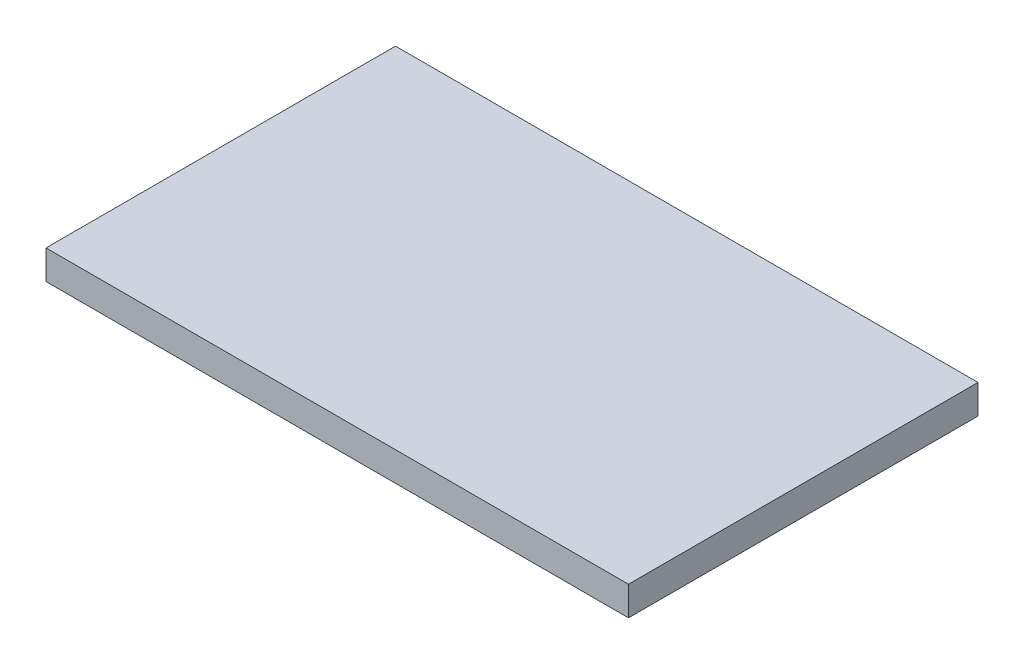
ISO-10303-21;
HEADER;
FILE_DESCRIPTION(('STEP AP214'),'2;1');
FILE_NAME('part.step','',(''),(''),'','','');
FILE_SCHEMA(('AUTOMOTIVE_DESIGN { 1 0 10303 214 1 1 1 1 }'));
ENDSEC;
DATA;
#1=APPLICATION_CONTEXT('core data for automotive mechanical design processes');
#2=APPLICATION_PROTOCOL_DEFINITION('international standard','automotive_design',2000,#1);
#3=PRODUCT_CONTEXT('',#1,'mechanical');
#4=PRODUCT('Part','Part','',(#3));
#5=PRODUCT_RELATED_PRODUCT_CATEGORY('part','',(#4));
#6=PRODUCT_DEFINITION_FORMATION('','',#4);
#7=PRODUCT_DEFINITION_CONTEXT('part definition',#1,'design');
#8=PRODUCT_DEFINITION('design','',#6,#7);
#9=PRODUCT_DEFINITION_SHAPE('','',#8);
#10=(LENGTH_UNIT() NAMED_UNIT(*) SI_UNIT(.MILLI.,.METRE.));
#11=(NAMED_UNIT(*) PLANE_ANGLE_UNIT() SI_UNIT($,.RADIAN.));
#12=(NAMED_UNIT(*) SI_UNIT($,.STERADIAN.) SOLID_ANGLE_UNIT());
#13=UNCERTAINTY_MEASURE_WITH_UNIT(LENGTH_MEASURE(1.E-05),#10,'distance_accuracy_value','');
#14=(GEOMETRIC_REPRESENTATION_CONTEXT(3) GLOBAL_UNCERTAINTY_ASSIGNED_CONTEXT((#13)) GLOBAL_UNIT_ASSIGNED_CONTEXT((#10,
#11,#12)) REPRESENTATION_CONTEXT('',''));
#15=CARTESIAN_POINT('',(0.,0.,0.));
#16=DIRECTION('',(0.,0.,1.));
#17=DIRECTION('',(1.,0.,0.));
#18=AXIS2_PLACEMENT_3D('',#15,#16,#17);
#19=CARTESIAN_POINT('',(88.9,38.1,76.2));
#20=DIRECTION('',(-1.,0.,0.));
#21=DIRECTION('',(0.,0.,1.));
#22=AXIS2_PLACEMENT_3D('',#19,#20,#21);
#23=PLANE('',#22);
#24=DIRECTION('',(0.,1.,0.));
#25=VECTOR('',#24,1.);
#26=CARTESIAN_POINT('',(88.9,38.1,0.));
#27=LINE('',#26,#25);
#28=CARTESIAN_POINT('',(88.9,31.75,0.));
#29=VERTEX_POINT('',#28);
#30=CARTESIAN_POINT('',(88.9,38.1,0.));
#31=VERTEX_POINT('',#30);
#32=EDGE_CURVE('E96',#29,#31,#27,.T.);
#33=ORIENTED_EDGE('',*,*,#32,.T.);
#34=DIRECTION('',(0.,0.,-1.));
#35=VECTOR('',#34,1.);
#36=CARTESIAN_POINT('',(88.9,38.1,76.2));
#37=LINE('',#36,#35);
#38=CARTESIAN_POINT('',(88.9,38.1,76.2));
#39=VERTEX_POINT('',#38);
#40=EDGE_CURVE('E11',#39,#31,#37,.T.);
#41=ORIENTED_EDGE('',*,*,#40,.F.);
#42=DIRECTION('',(0.,1.,0.));
#43=VECTOR('',#42,1.);
#44=CARTESIAN_POINT('',(88.9,38.1,76.2));
#45=LINE('',#44,#43);
#46=CARTESIAN_POINT('',(88.9,31.75,76.2));
#47=VERTEX_POINT('',#46);
#48=EDGE_CURVE('E84',#47,#39,#45,.T.);
#49=ORIENTED_EDGE('',*,*,#48,.F.);
#50=DIRECTION('',(0.,0.,-1.));
#51=VECTOR('',#50,1.);
#52=CARTESIAN_POINT('',(88.9,31.75,76.2));
#53=LINE('',#52,#51);
#54=EDGE_CURVE('E92',#47,#29,#53,.T.);
#55=ORIENTED_EDGE('',*,*,#54,.T.);
#56=EDGE_LOOP('',(#33,#41,#49,#55));
#57=FACE_BOUND('',#56,.T.);
#58=ADVANCED_FACE('F33',(#57),#23,.F.);
#59=CARTESIAN_POINT('',(88.9,38.1,76.2));
#60=DIRECTION('',(0.,-1.,0.));
#61=DIRECTION('',(1.,0.,0.));
#62=AXIS2_PLACEMENT_3D('',#59,#60,#61);
#63=PLANE('',#62);
#64=DIRECTION('',(-1.,0.,0.));
#65=VECTOR('',#64,1.);
#66=CARTESIAN_POINT('',(88.9,38.1,0.));
#67=LINE('',#66,#65);
#68=CARTESIAN_POINT('',(-38.1,38.1,0.));
#69=VERTEX_POINT('',#68);
#70=EDGE_CURVE('E88',#31,#69,#67,.T.);
#71=ORIENTED_EDGE('',*,*,#70,.T.);
#72=DIRECTION('',(0.,0.,-1.));
#73=VECTOR('',#72,1.);
#74=CARTESIAN_POINT('',(-38.1,38.1,76.2));
#75=LINE('',#74,#73);
#76=CARTESIAN_POINT('',(-38.1,38.1,76.2));
#77=VERTEX_POINT('',#76);
#78=EDGE_CURVE('E41',#77,#69,#75,.T.);
#79=ORIENTED_EDGE('',*,*,#78,.F.);
#80=DIRECTION('',(-1.,0.,0.));
#81=VECTOR('',#80,1.);
#82=CARTESIAN_POINT('',(88.9,38.1,76.2));
#83=LINE('',#82,#81);
#84=EDGE_CURVE('E79',#39,#77,#83,.T.);
#85=ORIENTED_EDGE('',*,*,#84,.F.);
#86=ORIENTED_EDGE('',*,*,#40,.T.);
#87=EDGE_LOOP('',(#71,#79,#85,#86));
#88=FACE_BOUND('',#87,.T.);
#89=ADVANCED_FACE('F87',(#88),#63,.F.);
#90=CARTESIAN_POINT('',(-38.1,38.1,76.2));
#91=DIRECTION('',(1.,0.,0.));
#92=DIRECTION('',(0.,0.,-1.));
#93=AXIS2_PLACEMENT_3D('',#90,#91,#92);
#94=PLANE('',#93);
#95=DIRECTION('',(0.,-1.,0.));
#96=VECTOR('',#95,1.);
#97=CARTESIAN_POINT('',(-38.1,38.1,0.));
#98=LINE('',#97,#96);
#99=CARTESIAN_POINT('',(-38.1,31.75,0.));
#100=VERTEX_POINT('',#99);
#101=EDGE_CURVE('E66',#69,#100,#98,.T.);
#102=ORIENTED_EDGE('',*,*,#101,.T.);
#103=DIRECTION('',(0.,0.,-1.));
#104=VECTOR('',#103,1.);
#105=CARTESIAN_POINT('',(-38.1,31.75,76.2));
#106=LINE('',#105,#104);
#107=CARTESIAN_POINT('',(-38.1,31.75,76.2));
#108=VERTEX_POINT('',#107);
#109=EDGE_CURVE('E89',#108,#100,#106,.T.);
#110=ORIENTED_EDGE('',*,*,#109,.F.);
#111=DIRECTION('',(0.,-1.,0.));
#112=VECTOR('',#111,1.);
#113=CARTESIAN_POINT('',(-38.1,38.1,76.2));
#114=LINE('',#113,#112);
#115=EDGE_CURVE('E82',#77,#108,#114,.T.);
#116=ORIENTED_EDGE('',*,*,#115,.F.);
#117=ORIENTED_EDGE('',*,*,#78,.T.);
#118=EDGE_LOOP('',(#102,#110,#116,#117));
#119=FACE_BOUND('',#118,.T.);
#120=ADVANCED_FACE('F90',(#119),#94,.F.);
#121=CARTESIAN_POINT('',(88.9,31.75,76.2));
#122=DIRECTION('',(0.,1.,0.));
#123=DIRECTION('',(-1.,0.,0.));
#124=AXIS2_PLACEMENT_3D('',#121,#122,#123);
#125=PLANE('',#124);
#126=DIRECTION('',(1.,0.,0.));
#127=VECTOR('',#126,1.);
#128=CARTESIAN_POINT('',(88.9,31.75,0.));
#129=LINE('',#128,#127);
#130=EDGE_CURVE('E72',#100,#29,#129,.T.);
#131=ORIENTED_EDGE('',*,*,#130,.T.);
#132=ORIENTED_EDGE('',*,*,#54,.F.);
#133=DIRECTION('',(1.,0.,0.));
#134=VECTOR('',#133,1.);
#135=CARTESIAN_POINT('',(88.9,31.75,76.2));
#136=LINE('',#135,#134);
#137=EDGE_CURVE('E49',#108,#47,#136,.T.);
#138=ORIENTED_EDGE('',*,*,#137,.F.);
#139=ORIENTED_EDGE('',*,*,#109,.T.);
#140=EDGE_LOOP('',(#131,#132,#138,#139));
#141=FACE_BOUND('',#140,.T.);
#142=ADVANCED_FACE('F103',(#141),#125,.F.);
#143=CARTESIAN_POINT('',(0.,0.,76.2));
#144=DIRECTION('',(0.,0.,-1.));
#145=DIRECTION('',(-1.,0.,0.));
#146=AXIS2_PLACEMENT_3D('',#143,#144,#145);
#147=PLANE('',#146);
#148=ORIENTED_EDGE('',*,*,#48,.T.);
#149=ORIENTED_EDGE('',*,*,#84,.T.);
#150=ORIENTED_EDGE('',*,*,#115,.T.);
#151=ORIENTED_EDGE('',*,*,#137,.T.);
#152=EDGE_LOOP('',(#148,#149,#150,#151));
#153=FACE_BOUND('',#152,.T.);
#154=ADVANCED_FACE('F80',(#153),#147,.F.);
#155=CARTESIAN_POINT('',(0.,0.,0.));
#156=DIRECTION('',(0.,0.,-1.));
#157=DIRECTION('',(-1.,0.,0.));
#158=AXIS2_PLACEMENT_3D('',#155,#156,#157);
#159=PLANE('',#158);
#160=ORIENTED_EDGE('',*,*,#32,.F.);
#161=ORIENTED_EDGE('',*,*,#130,.F.);
#162=ORIENTED_EDGE('',*,*,#101,.F.);
#163=ORIENTED_EDGE('',*,*,#70,.F.);
#164=EDGE_LOOP('',(#160,#161,#162,#163));
#165=FACE_BOUND('',#164,.T.);
#166=ADVANCED_FACE('F106',(#165),#159,.T.);
#167=CLOSED_SHELL('',(#58,#89,#120,#142,#154,#166));
#168=MANIFOLD_SOLID_BREP('B2',#167);
#169=ADVANCED_BREP_SHAPE_REPRESENTATION('',(#18,#168),#14);
#170=SHAPE_DEFINITION_REPRESENTATION(#9,#169);
ENDSEC;
END-ISO-10303-21;
